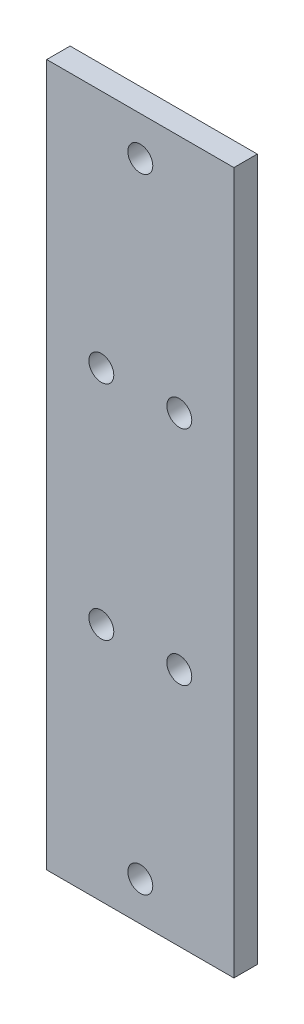
ISO-10303-21;
HEADER;
FILE_DESCRIPTION(('STEP AP214'),'2;1');
FILE_NAME('part.step','',(''),(''),'','','');
FILE_SCHEMA(('AUTOMOTIVE_DESIGN { 1 0 10303 214 1 1 1 1 }'));
ENDSEC;
DATA;
#1=APPLICATION_CONTEXT('core data for automotive mechanical design processes');
#2=APPLICATION_PROTOCOL_DEFINITION('international standard','automotive_design',2000,#1);
#3=PRODUCT_CONTEXT('',#1,'mechanical');
#4=PRODUCT('Part','Part','',(#3));
#5=PRODUCT_RELATED_PRODUCT_CATEGORY('part','',(#4));
#6=PRODUCT_DEFINITION_FORMATION('','',#4);
#7=PRODUCT_DEFINITION_CONTEXT('part definition',#1,'design');
#8=PRODUCT_DEFINITION('design','',#6,#7);
#9=PRODUCT_DEFINITION_SHAPE('','',#8);
#10=(LENGTH_UNIT() NAMED_UNIT(*) SI_UNIT(.MILLI.,.METRE.));
#11=(NAMED_UNIT(*) PLANE_ANGLE_UNIT() SI_UNIT($,.RADIAN.));
#12=(NAMED_UNIT(*) SI_UNIT($,.STERADIAN.) SOLID_ANGLE_UNIT());
#13=UNCERTAINTY_MEASURE_WITH_UNIT(LENGTH_MEASURE(1.E-05),#10,'distance_accuracy_value','');
#14=(GEOMETRIC_REPRESENTATION_CONTEXT(3) GLOBAL_UNCERTAINTY_ASSIGNED_CONTEXT((#13)) GLOBAL_UNIT_ASSIGNED_CONTEXT((#10,
#11,#12)) REPRESENTATION_CONTEXT('',''));
#15=CARTESIAN_POINT('',(0.,0.,0.));
#16=DIRECTION('',(0.,0.,1.));
#17=DIRECTION('',(1.,0.,0.));
#18=AXIS2_PLACEMENT_3D('',#15,#16,#17);
#19=CARTESIAN_POINT('',(0.,0.,3.));
#20=DIRECTION('',(0.,0.,-1.));
#21=DIRECTION('',(-1.,0.,0.));
#22=AXIS2_PLACEMENT_3D('',#19,#20,#21);
#23=PLANE('',#22);
#24=DIRECTION('',(0.,-1.,0.));
#25=VECTOR('',#24,1.);
#26=CARTESIAN_POINT('',(0.,0.,3.));
#27=LINE('',#26,#25);
#28=CARTESIAN_POINT('',(0.,90.,3.));
#29=VERTEX_POINT('',#28);
#30=CARTESIAN_POINT('',(0.,0.,3.));
#31=VERTEX_POINT('',#30);
#32=EDGE_CURVE('E96',#29,#31,#27,.T.);
#33=ORIENTED_EDGE('',*,*,#32,.T.);
#34=DIRECTION('',(1.,0.,0.));
#35=VECTOR('',#34,1.);
#36=CARTESIAN_POINT('',(0.,0.,3.));
#37=LINE('',#36,#35);
#38=CARTESIAN_POINT('',(24.,0.,3.));
#39=VERTEX_POINT('',#38);
#40=EDGE_CURVE('E91',#31,#39,#37,.T.);
#41=ORIENTED_EDGE('',*,*,#40,.T.);
#42=DIRECTION('',(0.,1.,0.));
#43=VECTOR('',#42,1.);
#44=CARTESIAN_POINT('',(24.,0.,3.));
#45=LINE('',#44,#43);
#46=CARTESIAN_POINT('',(24.,90.,3.));
#47=VERTEX_POINT('',#46);
#48=EDGE_CURVE('E94',#39,#47,#45,.T.);
#49=ORIENTED_EDGE('',*,*,#48,.T.);
#50=DIRECTION('',(-1.,0.,0.));
#51=VECTOR('',#50,1.);
#52=CARTESIAN_POINT('',(0.,90.,3.));
#53=LINE('',#52,#51);
#54=EDGE_CURVE('E61',#47,#29,#53,.T.);
#55=ORIENTED_EDGE('',*,*,#54,.T.);
#56=EDGE_LOOP('',(#33,#41,#49,#55));
#57=FACE_BOUND('',#56,.T.);
#58=CARTESIAN_POINT('',(7.,59.25,3.));
#59=DIRECTION('',(0.,0.,1.));
#60=DIRECTION('',(1.,0.,0.));
#61=AXIS2_PLACEMENT_3D('',#58,#59,#60);
#62=CIRCLE('',#61,1.6);
#63=CARTESIAN_POINT('',(8.6,59.25,3.));
#64=VERTEX_POINT('',#63);
#65=EDGE_CURVE('E116',#64,#64,#62,.T.);
#66=ORIENTED_EDGE('',*,*,#65,.F.);
#67=EDGE_LOOP('',(#66));
#68=FACE_BOUND('',#67,.T.);
#69=CARTESIAN_POINT('',(17.,59.25,3.));
#70=DIRECTION('',(0.,0.,1.));
#71=DIRECTION('',(1.,0.,0.));
#72=AXIS2_PLACEMENT_3D('',#69,#70,#71);
#73=CIRCLE('',#72,1.6);
#74=CARTESIAN_POINT('',(18.6,59.25,3.));
#75=VERTEX_POINT('',#74);
#76=EDGE_CURVE('E138',#75,#75,#73,.T.);
#77=ORIENTED_EDGE('',*,*,#76,.F.);
#78=EDGE_LOOP('',(#77));
#79=FACE_BOUND('',#78,.T.);
#80=CARTESIAN_POINT('',(7.,30.75,3.));
#81=DIRECTION('',(0.,0.,1.));
#82=DIRECTION('',(1.,0.,0.));
#83=AXIS2_PLACEMENT_3D('',#80,#81,#82);
#84=CIRCLE('',#83,1.6);
#85=CARTESIAN_POINT('',(8.6,30.75,3.));
#86=VERTEX_POINT('',#85);
#87=EDGE_CURVE('E146',#86,#86,#84,.T.);
#88=ORIENTED_EDGE('',*,*,#87,.F.);
#89=EDGE_LOOP('',(#88));
#90=FACE_BOUND('',#89,.T.);
#91=CARTESIAN_POINT('',(17.,30.75,3.));
#92=DIRECTION('',(0.,0.,1.));
#93=DIRECTION('',(1.,0.,0.));
#94=AXIS2_PLACEMENT_3D('',#91,#92,#93);
#95=CIRCLE('',#94,1.6);
#96=CARTESIAN_POINT('',(18.6,30.75,3.));
#97=VERTEX_POINT('',#96);
#98=EDGE_CURVE('E154',#97,#97,#95,.T.);
#99=ORIENTED_EDGE('',*,*,#98,.F.);
#100=EDGE_LOOP('',(#99));
#101=FACE_BOUND('',#100,.T.);
#102=CARTESIAN_POINT('',(12.,85.,3.));
#103=DIRECTION('',(0.,0.,1.));
#104=DIRECTION('',(1.,0.,0.));
#105=AXIS2_PLACEMENT_3D('',#102,#103,#104);
#106=CIRCLE('',#105,1.6);
#107=CARTESIAN_POINT('',(13.6,85.,3.));
#108=VERTEX_POINT('',#107);
#109=EDGE_CURVE('E162',#108,#108,#106,.T.);
#110=ORIENTED_EDGE('',*,*,#109,.F.);
#111=EDGE_LOOP('',(#110));
#112=FACE_BOUND('',#111,.T.);
#113=CARTESIAN_POINT('',(12.,5.,3.));
#114=DIRECTION('',(0.,0.,1.));
#115=DIRECTION('',(1.,0.,0.));
#116=AXIS2_PLACEMENT_3D('',#113,#114,#115);
#117=CIRCLE('',#116,1.6);
#118=CARTESIAN_POINT('',(13.6,5.,3.));
#119=VERTEX_POINT('',#118);
#120=EDGE_CURVE('E170',#119,#119,#117,.T.);
#121=ORIENTED_EDGE('',*,*,#120,.F.);
#122=EDGE_LOOP('',(#121));
#123=FACE_BOUND('',#122,.T.);
#124=ADVANCED_FACE('F43',(#57,#68,#79,#90,#101,#112,#123),#23,.F.);
#125=CARTESIAN_POINT('',(0.,0.,0.));
#126=DIRECTION('',(0.,0.,-1.));
#127=DIRECTION('',(-1.,0.,0.));
#128=AXIS2_PLACEMENT_3D('',#125,#126,#127);
#129=PLANE('',#128);
#130=CARTESIAN_POINT('',(12.,85.,0.));
#131=DIRECTION('',(0.,0.,1.));
#132=DIRECTION('',(1.,0.,0.));
#133=AXIS2_PLACEMENT_3D('',#130,#131,#132);
#134=CIRCLE('',#133,1.6);
#135=CARTESIAN_POINT('',(13.6,85.,0.));
#136=VERTEX_POINT('',#135);
#137=EDGE_CURVE('E166',#136,#136,#134,.T.);
#138=ORIENTED_EDGE('',*,*,#137,.T.);
#139=EDGE_LOOP('',(#138));
#140=FACE_BOUND('',#139,.T.);
#141=CARTESIAN_POINT('',(7.,30.75,0.));
#142=DIRECTION('',(0.,0.,1.));
#143=DIRECTION('',(1.,0.,0.));
#144=AXIS2_PLACEMENT_3D('',#141,#142,#143);
#145=CIRCLE('',#144,1.6);
#146=CARTESIAN_POINT('',(8.6,30.75,0.));
#147=VERTEX_POINT('',#146);
#148=EDGE_CURVE('E150',#147,#147,#145,.T.);
#149=ORIENTED_EDGE('',*,*,#148,.T.);
#150=EDGE_LOOP('',(#149));
#151=FACE_BOUND('',#150,.T.);
#152=CARTESIAN_POINT('',(7.,59.25,0.));
#153=DIRECTION('',(0.,0.,1.));
#154=DIRECTION('',(1.,0.,0.));
#155=AXIS2_PLACEMENT_3D('',#152,#153,#154);
#156=CIRCLE('',#155,1.6);
#157=CARTESIAN_POINT('',(8.6,59.25,0.));
#158=VERTEX_POINT('',#157);
#159=EDGE_CURVE('E134',#158,#158,#156,.T.);
#160=ORIENTED_EDGE('',*,*,#159,.T.);
#161=EDGE_LOOP('',(#160));
#162=FACE_BOUND('',#161,.T.);
#163=DIRECTION('',(0.,-1.,0.));
#164=VECTOR('',#163,1.);
#165=CARTESIAN_POINT('',(0.,0.,0.));
#166=LINE('',#165,#164);
#167=CARTESIAN_POINT('',(0.,90.,0.));
#168=VERTEX_POINT('',#167);
#169=CARTESIAN_POINT('',(0.,0.,0.));
#170=VERTEX_POINT('',#169);
#171=EDGE_CURVE('E112',#168,#170,#166,.T.);
#172=ORIENTED_EDGE('',*,*,#171,.F.);
#173=DIRECTION('',(-1.,0.,0.));
#174=VECTOR('',#173,1.);
#175=CARTESIAN_POINT('',(0.,90.,0.));
#176=LINE('',#175,#174);
#177=CARTESIAN_POINT('',(24.,90.,0.));
#178=VERTEX_POINT('',#177);
#179=EDGE_CURVE('E84',#178,#168,#176,.T.);
#180=ORIENTED_EDGE('',*,*,#179,.F.);
#181=DIRECTION('',(0.,1.,0.));
#182=VECTOR('',#181,1.);
#183=CARTESIAN_POINT('',(24.,0.,0.));
#184=LINE('',#183,#182);
#185=CARTESIAN_POINT('',(24.,0.,0.));
#186=VERTEX_POINT('',#185);
#187=EDGE_CURVE('E78',#186,#178,#184,.T.);
#188=ORIENTED_EDGE('',*,*,#187,.F.);
#189=DIRECTION('',(1.,0.,0.));
#190=VECTOR('',#189,1.);
#191=CARTESIAN_POINT('',(0.,0.,0.));
#192=LINE('',#191,#190);
#193=EDGE_CURVE('E101',#170,#186,#192,.T.);
#194=ORIENTED_EDGE('',*,*,#193,.F.);
#195=EDGE_LOOP('',(#172,#180,#188,#194));
#196=FACE_BOUND('',#195,.T.);
#197=CARTESIAN_POINT('',(17.,59.25,0.));
#198=DIRECTION('',(0.,0.,1.));
#199=DIRECTION('',(1.,0.,0.));
#200=AXIS2_PLACEMENT_3D('',#197,#198,#199);
#201=CIRCLE('',#200,1.6);
#202=CARTESIAN_POINT('',(18.6,59.25,0.));
#203=VERTEX_POINT('',#202);
#204=EDGE_CURVE('E142',#203,#203,#201,.T.);
#205=ORIENTED_EDGE('',*,*,#204,.T.);
#206=EDGE_LOOP('',(#205));
#207=FACE_BOUND('',#206,.T.);
#208=CARTESIAN_POINT('',(17.,30.75,0.));
#209=DIRECTION('',(0.,0.,1.));
#210=DIRECTION('',(1.,0.,0.));
#211=AXIS2_PLACEMENT_3D('',#208,#209,#210);
#212=CIRCLE('',#211,1.6);
#213=CARTESIAN_POINT('',(18.6,30.75,0.));
#214=VERTEX_POINT('',#213);
#215=EDGE_CURVE('E158',#214,#214,#212,.T.);
#216=ORIENTED_EDGE('',*,*,#215,.T.);
#217=EDGE_LOOP('',(#216));
#218=FACE_BOUND('',#217,.T.);
#219=CARTESIAN_POINT('',(12.,5.,0.));
#220=DIRECTION('',(0.,0.,1.));
#221=DIRECTION('',(1.,0.,0.));
#222=AXIS2_PLACEMENT_3D('',#219,#220,#221);
#223=CIRCLE('',#222,1.6);
#224=CARTESIAN_POINT('',(13.6,5.,0.));
#225=VERTEX_POINT('',#224);
#226=EDGE_CURVE('E174',#225,#225,#223,.T.);
#227=ORIENTED_EDGE('',*,*,#226,.T.);
#228=EDGE_LOOP('',(#227));
#229=FACE_BOUND('',#228,.T.);
#230=ADVANCED_FACE('F129',(#140,#151,#162,#196,#207,#218,#229),#129,.T.);
#231=CARTESIAN_POINT('',(0.,0.,3.));
#232=DIRECTION('',(1.,0.,0.));
#233=DIRECTION('',(0.,0.,-1.));
#234=AXIS2_PLACEMENT_3D('',#231,#232,#233);
#235=PLANE('',#234);
#236=ORIENTED_EDGE('',*,*,#171,.T.);
#237=DIRECTION('',(0.,0.,-1.));
#238=VECTOR('',#237,1.);
#239=CARTESIAN_POINT('',(0.,0.,3.));
#240=LINE('',#239,#238);
#241=EDGE_CURVE('E11',#31,#170,#240,.T.);
#242=ORIENTED_EDGE('',*,*,#241,.F.);
#243=ORIENTED_EDGE('',*,*,#32,.F.);
#244=DIRECTION('',(0.,0.,-1.));
#245=VECTOR('',#244,1.);
#246=CARTESIAN_POINT('',(0.,90.,3.));
#247=LINE('',#246,#245);
#248=EDGE_CURVE('E108',#29,#168,#247,.T.);
#249=ORIENTED_EDGE('',*,*,#248,.T.);
#250=EDGE_LOOP('',(#236,#242,#243,#249));
#251=FACE_BOUND('',#250,.T.);
#252=ADVANCED_FACE('F45',(#251),#235,.F.);
#253=CARTESIAN_POINT('',(0.,0.,3.));
#254=DIRECTION('',(0.,1.,0.));
#255=DIRECTION('',(0.,0.,1.));
#256=AXIS2_PLACEMENT_3D('',#253,#254,#255);
#257=PLANE('',#256);
#258=ORIENTED_EDGE('',*,*,#193,.T.);
#259=DIRECTION('',(0.,0.,-1.));
#260=VECTOR('',#259,1.);
#261=CARTESIAN_POINT('',(24.,0.,3.));
#262=LINE('',#261,#260);
#263=EDGE_CURVE('E53',#39,#186,#262,.T.);
#264=ORIENTED_EDGE('',*,*,#263,.F.);
#265=ORIENTED_EDGE('',*,*,#40,.F.);
#266=ORIENTED_EDGE('',*,*,#241,.T.);
#267=EDGE_LOOP('',(#258,#264,#265,#266));
#268=FACE_BOUND('',#267,.T.);
#269=ADVANCED_FACE('F100',(#268),#257,.F.);
#270=CARTESIAN_POINT('',(24.,0.,3.));
#271=DIRECTION('',(-1.,0.,0.));
#272=DIRECTION('',(0.,0.,1.));
#273=AXIS2_PLACEMENT_3D('',#270,#271,#272);
#274=PLANE('',#273);
#275=ORIENTED_EDGE('',*,*,#187,.T.);
#276=DIRECTION('',(0.,0.,-1.));
#277=VECTOR('',#276,1.);
#278=CARTESIAN_POINT('',(24.,90.,3.));
#279=LINE('',#278,#277);
#280=EDGE_CURVE('E103',#47,#178,#279,.T.);
#281=ORIENTED_EDGE('',*,*,#280,.F.);
#282=ORIENTED_EDGE('',*,*,#48,.F.);
#283=ORIENTED_EDGE('',*,*,#263,.T.);
#284=EDGE_LOOP('',(#275,#281,#282,#283));
#285=FACE_BOUND('',#284,.T.);
#286=ADVANCED_FACE('F104',(#285),#274,.F.);
#287=CARTESIAN_POINT('',(0.,90.,3.));
#288=DIRECTION('',(0.,-1.,0.));
#289=DIRECTION('',(1.,0.,0.));
#290=AXIS2_PLACEMENT_3D('',#287,#288,#289);
#291=PLANE('',#290);
#292=ORIENTED_EDGE('',*,*,#179,.T.);
#293=ORIENTED_EDGE('',*,*,#248,.F.);
#294=ORIENTED_EDGE('',*,*,#54,.F.);
#295=ORIENTED_EDGE('',*,*,#280,.T.);
#296=EDGE_LOOP('',(#292,#293,#294,#295));
#297=FACE_BOUND('',#296,.T.);
#298=ADVANCED_FACE('F126',(#297),#291,.F.);
#299=CARTESIAN_POINT('',(7.,59.25,3.));
#300=DIRECTION('',(0.,0.,-1.));
#301=DIRECTION('',(-1.,0.,0.));
#302=AXIS2_PLACEMENT_3D('',#299,#300,#301);
#303=CYLINDRICAL_SURFACE('',#302,1.6);
#304=ORIENTED_EDGE('',*,*,#65,.T.);
#305=EDGE_LOOP('',(#304));
#306=FACE_BOUND('',#305,.T.);
#307=ORIENTED_EDGE('',*,*,#159,.F.);
#308=EDGE_LOOP('',(#307));
#309=FACE_BOUND('',#308,.T.);
#310=ADVANCED_FACE('F193',(#306,#309),#303,.F.);
#311=CARTESIAN_POINT('',(17.,59.25,3.));
#312=DIRECTION('',(0.,0.,-1.));
#313=DIRECTION('',(-1.,0.,0.));
#314=AXIS2_PLACEMENT_3D('',#311,#312,#313);
#315=CYLINDRICAL_SURFACE('',#314,1.6);
#316=ORIENTED_EDGE('',*,*,#76,.T.);
#317=EDGE_LOOP('',(#316));
#318=FACE_BOUND('',#317,.T.);
#319=ORIENTED_EDGE('',*,*,#204,.F.);
#320=EDGE_LOOP('',(#319));
#321=FACE_BOUND('',#320,.T.);
#322=ADVANCED_FACE('F247',(#318,#321),#315,.F.);
#323=CARTESIAN_POINT('',(7.,30.75,3.));
#324=DIRECTION('',(0.,0.,-1.));
#325=DIRECTION('',(-1.,0.,0.));
#326=AXIS2_PLACEMENT_3D('',#323,#324,#325);
#327=CYLINDRICAL_SURFACE('',#326,1.6);
#328=ORIENTED_EDGE('',*,*,#87,.T.);
#329=EDGE_LOOP('',(#328));
#330=FACE_BOUND('',#329,.T.);
#331=ORIENTED_EDGE('',*,*,#148,.F.);
#332=EDGE_LOOP('',(#331));
#333=FACE_BOUND('',#332,.T.);
#334=ADVANCED_FACE('F256',(#330,#333),#327,.F.);
#335=CARTESIAN_POINT('',(17.,30.75,3.));
#336=DIRECTION('',(0.,0.,-1.));
#337=DIRECTION('',(-1.,0.,0.));
#338=AXIS2_PLACEMENT_3D('',#335,#336,#337);
#339=CYLINDRICAL_SURFACE('',#338,1.6);
#340=ORIENTED_EDGE('',*,*,#98,.T.);
#341=EDGE_LOOP('',(#340));
#342=FACE_BOUND('',#341,.T.);
#343=ORIENTED_EDGE('',*,*,#215,.F.);
#344=EDGE_LOOP('',(#343));
#345=FACE_BOUND('',#344,.T.);
#346=ADVANCED_FACE('F265',(#342,#345),#339,.F.);
#347=CARTESIAN_POINT('',(12.,85.,3.));
#348=DIRECTION('',(0.,0.,-1.));
#349=DIRECTION('',(-1.,0.,0.));
#350=AXIS2_PLACEMENT_3D('',#347,#348,#349);
#351=CYLINDRICAL_SURFACE('',#350,1.6);
#352=ORIENTED_EDGE('',*,*,#109,.T.);
#353=EDGE_LOOP('',(#352));
#354=FACE_BOUND('',#353,.T.);
#355=ORIENTED_EDGE('',*,*,#137,.F.);
#356=EDGE_LOOP('',(#355));
#357=FACE_BOUND('',#356,.T.);
#358=ADVANCED_FACE('F275',(#354,#357),#351,.F.);
#359=CARTESIAN_POINT('',(12.,5.,3.));
#360=DIRECTION('',(0.,0.,-1.));
#361=DIRECTION('',(-1.,0.,0.));
#362=AXIS2_PLACEMENT_3D('',#359,#360,#361);
#363=CYLINDRICAL_SURFACE('',#362,1.6);
#364=ORIENTED_EDGE('',*,*,#120,.T.);
#365=EDGE_LOOP('',(#364));
#366=FACE_BOUND('',#365,.T.);
#367=ORIENTED_EDGE('',*,*,#226,.F.);
#368=EDGE_LOOP('',(#367));
#369=FACE_BOUND('',#368,.T.);
#370=ADVANCED_FACE('F182',(#366,#369),#363,.F.);
#371=CLOSED_SHELL('',(#124,#230,#252,#269,#286,#298,#310,#322,#334,#346,#358,#370));
#372=MANIFOLD_SOLID_BREP('B2',#371);
#373=ADVANCED_BREP_SHAPE_REPRESENTATION('',(#18,#372),#14);
#374=SHAPE_DEFINITION_REPRESENTATION(#9,#373);
ENDSEC;
END-ISO-10303-21;
